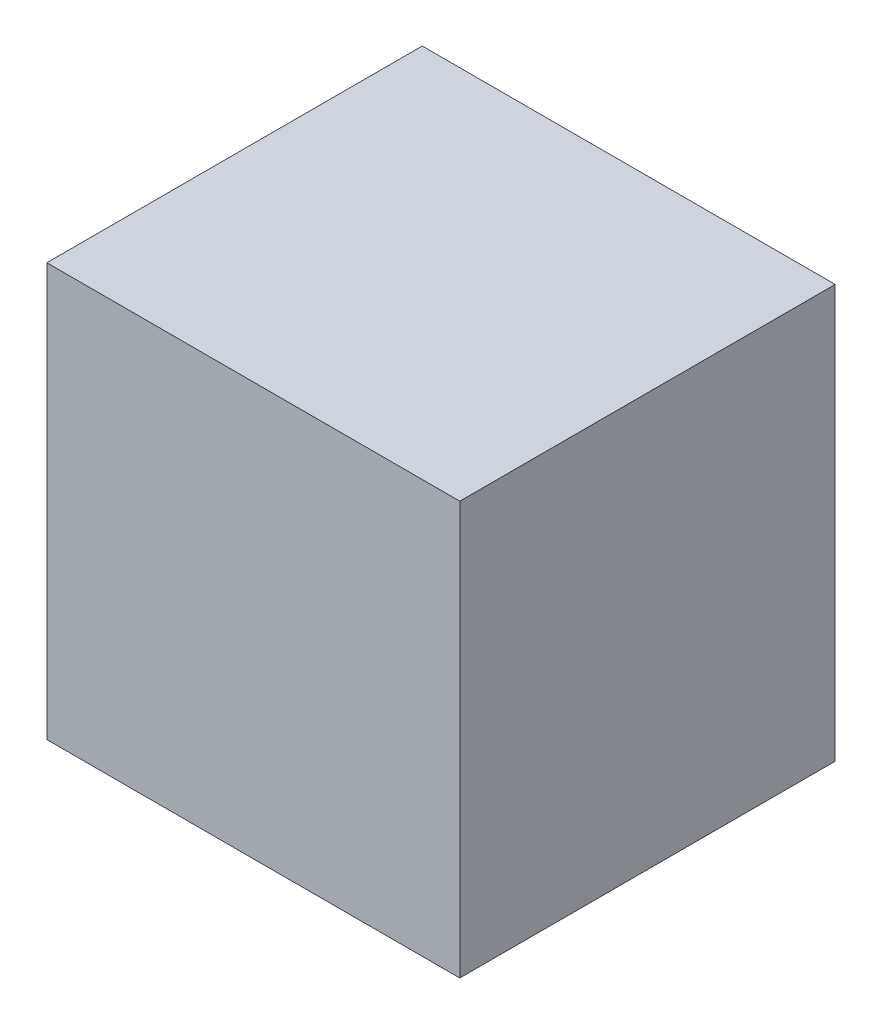
ISO-10303-21;
HEADER;
FILE_DESCRIPTION(('STEP AP214'),'2;1');
FILE_NAME('part.step','',(''),(''),'','','');
FILE_SCHEMA(('AUTOMOTIVE_DESIGN { 1 0 10303 214 1 1 1 1 }'));
ENDSEC;
DATA;
#1=APPLICATION_CONTEXT('core data for automotive mechanical design processes');
#2=APPLICATION_PROTOCOL_DEFINITION('international standard','automotive_design',2000,#1);
#3=PRODUCT_CONTEXT('',#1,'mechanical');
#4=PRODUCT('Part','Part','',(#3));
#5=PRODUCT_RELATED_PRODUCT_CATEGORY('part','',(#4));
#6=PRODUCT_DEFINITION_FORMATION('','',#4);
#7=PRODUCT_DEFINITION_CONTEXT('part definition',#1,'design');
#8=PRODUCT_DEFINITION('design','',#6,#7);
#9=PRODUCT_DEFINITION_SHAPE('','',#8);
#10=(LENGTH_UNIT() NAMED_UNIT(*) SI_UNIT(.MILLI.,.METRE.));
#11=(NAMED_UNIT(*) PLANE_ANGLE_UNIT() SI_UNIT($,.RADIAN.));
#12=(NAMED_UNIT(*) SI_UNIT($,.STERADIAN.) SOLID_ANGLE_UNIT());
#13=UNCERTAINTY_MEASURE_WITH_UNIT(LENGTH_MEASURE(1.E-05),#10,'distance_accuracy_value','');
#14=(GEOMETRIC_REPRESENTATION_CONTEXT(3) GLOBAL_UNCERTAINTY_ASSIGNED_CONTEXT((#13)) GLOBAL_UNIT_ASSIGNED_CONTEXT((#10,
#11,#12)) REPRESENTATION_CONTEXT('',''));
#15=CARTESIAN_POINT('',(0.,0.,0.));
#16=DIRECTION('',(0.,0.,1.));
#17=DIRECTION('',(1.,0.,0.));
#18=AXIS2_PLACEMENT_3D('',#15,#16,#17);
#19=CARTESIAN_POINT('',(-10.,-6.,20.));
#20=DIRECTION('',(1.,0.,0.));
#21=DIRECTION('',(0.,0.,-1.));
#22=AXIS2_PLACEMENT_3D('',#19,#20,#21);
#23=PLANE('',#22);
#24=DIRECTION('',(0.,-1.,0.));
#25=VECTOR('',#24,1.);
#26=CARTESIAN_POINT('',(-10.,-6.,0.));
#27=LINE('',#26,#25);
#28=CARTESIAN_POINT('',(-10.,16.,0.));
#29=VERTEX_POINT('',#28);
#30=CARTESIAN_POINT('',(-10.,-6.,0.));
#31=VERTEX_POINT('',#30);
#32=EDGE_CURVE('E105',#29,#31,#27,.T.);
#33=ORIENTED_EDGE('',*,*,#32,.T.);
#34=DIRECTION('',(0.,0.,-1.));
#35=VECTOR('',#34,1.);
#36=CARTESIAN_POINT('',(-10.,-6.,20.));
#37=LINE('',#36,#35);
#38=CARTESIAN_POINT('',(-10.,-6.,20.));
#39=VERTEX_POINT('',#38);
#40=EDGE_CURVE('E11',#39,#31,#37,.T.);
#41=ORIENTED_EDGE('',*,*,#40,.F.);
#42=DIRECTION('',(0.,-1.,0.));
#43=VECTOR('',#42,1.);
#44=CARTESIAN_POINT('',(-10.,-6.,20.));
#45=LINE('',#44,#43);
#46=CARTESIAN_POINT('',(-10.,16.,20.));
#47=VERTEX_POINT('',#46);
#48=EDGE_CURVE('E89',#47,#39,#45,.T.);
#49=ORIENTED_EDGE('',*,*,#48,.F.);
#50=DIRECTION('',(0.,0.,-1.));
#51=VECTOR('',#50,1.);
#52=CARTESIAN_POINT('',(-10.,16.,20.));
#53=LINE('',#52,#51);
#54=EDGE_CURVE('E97',#47,#29,#53,.T.);
#55=ORIENTED_EDGE('',*,*,#54,.T.);
#56=EDGE_LOOP('',(#33,#41,#49,#55));
#57=FACE_BOUND('',#56,.T.);
#58=ADVANCED_FACE('F39',(#57),#23,.F.);
#59=CARTESIAN_POINT('',(-10.,-6.,20.));
#60=DIRECTION('',(0.,1.,0.));
#61=DIRECTION('',(0.,0.,1.));
#62=AXIS2_PLACEMENT_3D('',#59,#60,#61);
#63=PLANE('',#62);
#64=DIRECTION('',(1.,0.,0.));
#65=VECTOR('',#64,1.);
#66=CARTESIAN_POINT('',(-10.,-6.,0.));
#67=LINE('',#66,#65);
#68=CARTESIAN_POINT('',(12.,-6.,0.));
#69=VERTEX_POINT('',#68);
#70=EDGE_CURVE('E92',#31,#69,#67,.T.);
#71=ORIENTED_EDGE('',*,*,#70,.T.);
#72=DIRECTION('',(0.,0.,-1.));
#73=VECTOR('',#72,1.);
#74=CARTESIAN_POINT('',(12.,-6.,20.));
#75=LINE('',#74,#73);
#76=CARTESIAN_POINT('',(12.,-6.,20.));
#77=VERTEX_POINT('',#76);
#78=EDGE_CURVE('E50',#77,#69,#75,.T.);
#79=ORIENTED_EDGE('',*,*,#78,.F.);
#80=DIRECTION('',(1.,0.,0.));
#81=VECTOR('',#80,1.);
#82=CARTESIAN_POINT('',(-10.,-6.,20.));
#83=LINE('',#82,#81);
#84=EDGE_CURVE('E82',#39,#77,#83,.T.);
#85=ORIENTED_EDGE('',*,*,#84,.F.);
#86=ORIENTED_EDGE('',*,*,#40,.T.);
#87=EDGE_LOOP('',(#71,#79,#85,#86));
#88=FACE_BOUND('',#87,.T.);
#89=ADVANCED_FACE('F93',(#88),#63,.F.);
#90=CARTESIAN_POINT('',(12.,-6.,20.));
#91=DIRECTION('',(-1.,0.,0.));
#92=DIRECTION('',(0.,0.,1.));
#93=AXIS2_PLACEMENT_3D('',#90,#91,#92);
#94=PLANE('',#93);
#95=DIRECTION('',(0.,1.,0.));
#96=VECTOR('',#95,1.);
#97=CARTESIAN_POINT('',(12.,-6.,0.));
#98=LINE('',#97,#96);
#99=CARTESIAN_POINT('',(12.,16.,0.));
#100=VERTEX_POINT('',#99);
#101=EDGE_CURVE('E72',#69,#100,#98,.T.);
#102=ORIENTED_EDGE('',*,*,#101,.T.);
#103=DIRECTION('',(0.,0.,-1.));
#104=VECTOR('',#103,1.);
#105=CARTESIAN_POINT('',(12.,16.,20.));
#106=LINE('',#105,#104);
#107=CARTESIAN_POINT('',(12.,16.,20.));
#108=VERTEX_POINT('',#107);
#109=EDGE_CURVE('E94',#108,#100,#106,.T.);
#110=ORIENTED_EDGE('',*,*,#109,.F.);
#111=DIRECTION('',(0.,1.,0.));
#112=VECTOR('',#111,1.);
#113=CARTESIAN_POINT('',(12.,-6.,20.));
#114=LINE('',#113,#112);
#115=EDGE_CURVE('E88',#77,#108,#114,.T.);
#116=ORIENTED_EDGE('',*,*,#115,.F.);
#117=ORIENTED_EDGE('',*,*,#78,.T.);
#118=EDGE_LOOP('',(#102,#110,#116,#117));
#119=FACE_BOUND('',#118,.T.);
#120=ADVANCED_FACE('F96',(#119),#94,.F.);
#121=CARTESIAN_POINT('',(-10.,16.,20.));
#122=DIRECTION('',(0.,-1.,0.));
#123=DIRECTION('',(0.,0.,-1.));
#124=AXIS2_PLACEMENT_3D('',#121,#122,#123);
#125=PLANE('',#124);
#126=DIRECTION('',(-1.,0.,0.));
#127=VECTOR('',#126,1.);
#128=CARTESIAN_POINT('',(-10.,16.,0.));
#129=LINE('',#128,#127);
#130=EDGE_CURVE('E76',#100,#29,#129,.T.);
#131=ORIENTED_EDGE('',*,*,#130,.T.);
#132=ORIENTED_EDGE('',*,*,#54,.F.);
#133=DIRECTION('',(-1.,0.,0.));
#134=VECTOR('',#133,1.);
#135=CARTESIAN_POINT('',(-10.,16.,20.));
#136=LINE('',#135,#134);
#137=EDGE_CURVE('E54',#108,#47,#136,.T.);
#138=ORIENTED_EDGE('',*,*,#137,.F.);
#139=ORIENTED_EDGE('',*,*,#109,.T.);
#140=EDGE_LOOP('',(#131,#132,#138,#139));
#141=FACE_BOUND('',#140,.T.);
#142=ADVANCED_FACE('F108',(#141),#125,.F.);
#143=CARTESIAN_POINT('',(0.,0.,20.));
#144=DIRECTION('',(0.,0.,-1.));
#145=DIRECTION('',(-1.,0.,0.));
#146=AXIS2_PLACEMENT_3D('',#143,#144,#145);
#147=PLANE('',#146);
#148=ORIENTED_EDGE('',*,*,#48,.T.);
#149=ORIENTED_EDGE('',*,*,#84,.T.);
#150=ORIENTED_EDGE('',*,*,#115,.T.);
#151=ORIENTED_EDGE('',*,*,#137,.T.);
#152=EDGE_LOOP('',(#148,#149,#150,#151));
#153=FACE_BOUND('',#152,.T.);
#154=ADVANCED_FACE('F86',(#153),#147,.F.);
#155=CARTESIAN_POINT('',(0.,0.,0.));
#156=DIRECTION('',(0.,0.,-1.));
#157=DIRECTION('',(-1.,0.,0.));
#158=AXIS2_PLACEMENT_3D('',#155,#156,#157);
#159=PLANE('',#158);
#160=ORIENTED_EDGE('',*,*,#32,.F.);
#161=ORIENTED_EDGE('',*,*,#130,.F.);
#162=ORIENTED_EDGE('',*,*,#101,.F.);
#163=ORIENTED_EDGE('',*,*,#70,.F.);
#164=EDGE_LOOP('',(#160,#161,#162,#163));
#165=FACE_BOUND('',#164,.T.);
#166=ADVANCED_FACE('F115',(#165),#159,.T.);
#167=CLOSED_SHELL('',(#58,#89,#120,#142,#154,#166));
#168=MANIFOLD_SOLID_BREP('B2',#167);
#169=ADVANCED_BREP_SHAPE_REPRESENTATION('',(#18,#168),#14);
#170=SHAPE_DEFINITION_REPRESENTATION(#9,#169);
ENDSEC;
END-ISO-10303-21;
